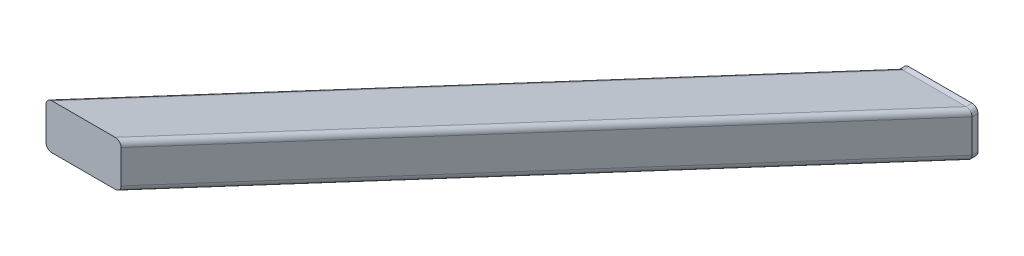
ISO-10303-21;
HEADER;
FILE_DESCRIPTION(('STEP AP214'),'2;1');
FILE_NAME('part.step','',(''),(''),'','','');
FILE_SCHEMA(('AUTOMOTIVE_DESIGN { 1 0 10303 214 1 1 1 1 }'));
ENDSEC;
DATA;
#1=APPLICATION_CONTEXT('core data for automotive mechanical design processes');
#2=APPLICATION_PROTOCOL_DEFINITION('international standard','automotive_design',2000,#1);
#3=PRODUCT_CONTEXT('',#1,'mechanical');
#4=PRODUCT('Part','Part','',(#3));
#5=PRODUCT_RELATED_PRODUCT_CATEGORY('part','',(#4));
#6=PRODUCT_DEFINITION_FORMATION('','',#4);
#7=PRODUCT_DEFINITION_CONTEXT('part definition',#1,'design');
#8=PRODUCT_DEFINITION('design','',#6,#7);
#9=PRODUCT_DEFINITION_SHAPE('','',#8);
#10=(LENGTH_UNIT() NAMED_UNIT(*) SI_UNIT(.MILLI.,.METRE.));
#11=(NAMED_UNIT(*) PLANE_ANGLE_UNIT() SI_UNIT($,.RADIAN.));
#12=(NAMED_UNIT(*) SI_UNIT($,.STERADIAN.) SOLID_ANGLE_UNIT());
#13=UNCERTAINTY_MEASURE_WITH_UNIT(LENGTH_MEASURE(1.E-05),#10,'distance_accuracy_value','');
#14=(GEOMETRIC_REPRESENTATION_CONTEXT(3) GLOBAL_UNCERTAINTY_ASSIGNED_CONTEXT((#13)) GLOBAL_UNIT_ASSIGNED_CONTEXT((#10,
#11,#12)) REPRESENTATION_CONTEXT('',''));
#15=CARTESIAN_POINT('',(0.,0.,0.));
#16=DIRECTION('',(0.,0.,1.));
#17=DIRECTION('',(1.,0.,0.));
#18=AXIS2_PLACEMENT_3D('',#15,#16,#17);
#19=CARTESIAN_POINT('',(10.,-66.2,10.));
#20=DIRECTION('',(0.,0.,-1.));
#21=DIRECTION('',(-1.,0.,0.));
#22=AXIS2_PLACEMENT_3D('',#19,#20,#21);
#23=CYLINDRICAL_SURFACE('',#22,10.);
#24=CARTESIAN_POINT('',(10.,-66.2,0.));
#25=DIRECTION('',(0.,0.,1.));
#26=DIRECTION('',(1.,0.,0.));
#27=AXIS2_PLACEMENT_3D('',#24,#25,#26);
#28=CIRCLE('',#27,10.);
#29=CARTESIAN_POINT('',(0.,-66.1999999999999,0.));
#30=VERTEX_POINT('',#29);
#31=CARTESIAN_POINT('',(10.0000000000001,-76.2,0.));
#32=VERTEX_POINT('',#31);
#33=EDGE_CURVE('E169',#30,#32,#28,.T.);
#34=ORIENTED_EDGE('',*,*,#33,.T.);
#35=DIRECTION('',(0.,0.,-1.));
#36=VECTOR('',#35,1.);
#37=CARTESIAN_POINT('',(10.0000000000001,-76.2,10.));
#38=LINE('',#37,#36);
#39=CARTESIAN_POINT('',(10.0000000000001,-76.2,10.));
#40=VERTEX_POINT('',#39);
#41=EDGE_CURVE('E11',#40,#32,#38,.T.);
#42=ORIENTED_EDGE('',*,*,#41,.F.);
#43=CARTESIAN_POINT('',(10.,-66.2,10.));
#44=DIRECTION('',(0.,0.,1.));
#45=DIRECTION('',(1.,0.,0.));
#46=AXIS2_PLACEMENT_3D('',#43,#44,#45);
#47=CIRCLE('',#46,10.);
#48=CARTESIAN_POINT('',(0.,-66.1999999999999,10.0000000000001));
#49=VERTEX_POINT('',#48);
#50=EDGE_CURVE('E173',#49,#40,#47,.T.);
#51=ORIENTED_EDGE('',*,*,#50,.F.);
#52=DIRECTION('',(0.,0.,-1.));
#53=VECTOR('',#52,1.);
#54=CARTESIAN_POINT('',(0.,-66.1999999999999,10.));
#55=LINE('',#54,#53);
#56=EDGE_CURVE('E186',#49,#30,#55,.T.);
#57=ORIENTED_EDGE('',*,*,#56,.T.);
#58=EDGE_LOOP('',(#34,#42,#51,#57));
#59=FACE_BOUND('',#58,.T.);
#60=ADVANCED_FACE('F35',(#59),#23,.T.);
#61=CARTESIAN_POINT('',(10.0000000000001,-76.2,10.));
#62=DIRECTION('',(0.,1.,0.));
#63=DIRECTION('',(0.,0.,1.));
#64=AXIS2_PLACEMENT_3D('',#61,#62,#63);
#65=PLANE('',#64);
#66=DIRECTION('',(1.,0.,0.));
#67=VECTOR('',#66,1.);
#68=CARTESIAN_POINT('',(10.0000000000001,-76.2,0.));
#69=LINE('',#68,#67);
#70=CARTESIAN_POINT('',(117.,-76.2,0.));
#71=VERTEX_POINT('',#70);
#72=EDGE_CURVE('E189',#32,#71,#69,.T.);
#73=ORIENTED_EDGE('',*,*,#72,.T.);
#74=DIRECTION('',(0.,0.,-1.));
#75=VECTOR('',#74,1.);
#76=CARTESIAN_POINT('',(117.,-76.2,10.));
#77=LINE('',#76,#75);
#78=CARTESIAN_POINT('',(117.,-76.2,10.));
#79=VERTEX_POINT('',#78);
#80=EDGE_CURVE('E43',#79,#71,#77,.T.);
#81=ORIENTED_EDGE('',*,*,#80,.F.);
#82=DIRECTION('',(1.,0.,0.));
#83=VECTOR('',#82,1.);
#84=CARTESIAN_POINT('',(10.0000000000001,-76.2,10.));
#85=LINE('',#84,#83);
#86=EDGE_CURVE('E93',#40,#79,#85,.T.);
#87=ORIENTED_EDGE('',*,*,#86,.F.);
#88=ORIENTED_EDGE('',*,*,#41,.T.);
#89=EDGE_LOOP('',(#73,#81,#87,#88));
#90=FACE_BOUND('',#89,.T.);
#91=ADVANCED_FACE('F285',(#90),#65,.F.);
#92=CARTESIAN_POINT('',(117.,-66.2,10.));
#93=DIRECTION('',(0.,0.,-1.));
#94=DIRECTION('',(-1.,0.,0.));
#95=AXIS2_PLACEMENT_3D('',#92,#93,#94);
#96=CYLINDRICAL_SURFACE('',#95,10.);
#97=CARTESIAN_POINT('',(117.,-66.2,0.));
#98=DIRECTION('',(0.,0.,1.));
#99=DIRECTION('',(1.,0.,0.));
#100=AXIS2_PLACEMENT_3D('',#97,#98,#99);
#101=CIRCLE('',#100,10.);
#102=CARTESIAN_POINT('',(127.,-66.1999999999999,0.));
#103=VERTEX_POINT('',#102);
#104=EDGE_CURVE('E191',#71,#103,#101,.T.);
#105=ORIENTED_EDGE('',*,*,#104,.T.);
#106=DIRECTION('',(0.,0.,-1.));
#107=VECTOR('',#106,1.);
#108=CARTESIAN_POINT('',(127.,-66.1999999999999,10.));
#109=LINE('',#108,#107);
#110=CARTESIAN_POINT('',(127.,-66.1999999999999,10.));
#111=VERTEX_POINT('',#110);
#112=EDGE_CURVE('E204',#111,#103,#109,.T.);
#113=ORIENTED_EDGE('',*,*,#112,.F.);
#114=CARTESIAN_POINT('',(117.,-66.2,10.));
#115=DIRECTION('',(0.,0.,1.));
#116=DIRECTION('',(1.,0.,0.));
#117=AXIS2_PLACEMENT_3D('',#114,#115,#116);
#118=CIRCLE('',#117,10.);
#119=EDGE_CURVE('E177',#79,#111,#118,.T.);
#120=ORIENTED_EDGE('',*,*,#119,.F.);
#121=ORIENTED_EDGE('',*,*,#80,.T.);
#122=EDGE_LOOP('',(#105,#113,#120,#121));
#123=FACE_BOUND('',#122,.T.);
#124=ADVANCED_FACE('F210',(#123),#96,.T.);
#125=CARTESIAN_POINT('',(127.,-10.0000000000001,10.));
#126=DIRECTION('',(-1.,0.,0.));
#127=DIRECTION('',(0.,0.,1.));
#128=AXIS2_PLACEMENT_3D('',#125,#126,#127);
#129=PLANE('',#128);
#130=DIRECTION('',(0.,1.,0.));
#131=VECTOR('',#130,1.);
#132=CARTESIAN_POINT('',(127.,-10.0000000000001,0.));
#133=LINE('',#132,#131);
#134=CARTESIAN_POINT('',(127.,-10.0000000000001,0.));
#135=VERTEX_POINT('',#134);
#136=EDGE_CURVE('E193',#103,#135,#133,.T.);
#137=ORIENTED_EDGE('',*,*,#136,.T.);
#138=DIRECTION('',(0.,0.,-1.));
#139=VECTOR('',#138,1.);
#140=CARTESIAN_POINT('',(127.,-10.0000000000001,10.));
#141=LINE('',#140,#139);
#142=CARTESIAN_POINT('',(127.,-10.0000000000001,10.));
#143=VERTEX_POINT('',#142);
#144=EDGE_CURVE('E119',#143,#135,#141,.T.);
#145=ORIENTED_EDGE('',*,*,#144,.F.);
#146=DIRECTION('',(0.,1.,0.));
#147=VECTOR('',#146,1.);
#148=CARTESIAN_POINT('',(127.,-10.0000000000001,10.));
#149=LINE('',#148,#147);
#150=EDGE_CURVE('E140',#111,#143,#149,.T.);
#151=ORIENTED_EDGE('',*,*,#150,.F.);
#152=ORIENTED_EDGE('',*,*,#112,.T.);
#153=EDGE_LOOP('',(#137,#145,#151,#152));
#154=FACE_BOUND('',#153,.T.);
#155=ADVANCED_FACE('F216',(#154),#129,.F.);
#156=CARTESIAN_POINT('',(117.,-10.,10.));
#157=DIRECTION('',(0.,0.,-1.));
#158=DIRECTION('',(-1.,0.,0.));
#159=AXIS2_PLACEMENT_3D('',#156,#157,#158);
#160=CYLINDRICAL_SURFACE('',#159,10.);
#161=CARTESIAN_POINT('',(117.,-10.,0.));
#162=DIRECTION('',(0.,0.,1.));
#163=DIRECTION('',(-1.,0.,0.));
#164=AXIS2_PLACEMENT_3D('',#161,#162,#163);
#165=CIRCLE('',#164,10.);
#166=CARTESIAN_POINT('',(117.,0.,0.));
#167=VERTEX_POINT('',#166);
#168=EDGE_CURVE('E116',#135,#167,#165,.T.);
#169=ORIENTED_EDGE('',*,*,#168,.T.);
#170=DIRECTION('',(0.,0.,-1.));
#171=VECTOR('',#170,1.);
#172=CARTESIAN_POINT('',(117.,0.,10.));
#173=LINE('',#172,#171);
#174=CARTESIAN_POINT('',(117.,0.,10.));
#175=VERTEX_POINT('',#174);
#176=EDGE_CURVE('E108',#175,#167,#173,.T.);
#177=ORIENTED_EDGE('',*,*,#176,.F.);
#178=CARTESIAN_POINT('',(117.,-10.,10.));
#179=DIRECTION('',(0.,0.,1.));
#180=DIRECTION('',(-1.,0.,0.));
#181=AXIS2_PLACEMENT_3D('',#178,#179,#180);
#182=CIRCLE('',#181,10.);
#183=EDGE_CURVE('E113',#143,#175,#182,.T.);
#184=ORIENTED_EDGE('',*,*,#183,.F.);
#185=ORIENTED_EDGE('',*,*,#144,.T.);
#186=EDGE_LOOP('',(#169,#177,#184,#185));
#187=FACE_BOUND('',#186,.T.);
#188=ADVANCED_FACE('F110',(#187),#160,.T.);
#189=CARTESIAN_POINT('',(10.0000000000001,0.,10.));
#190=DIRECTION('',(0.,-1.,0.));
#191=DIRECTION('',(0.,0.,-1.));
#192=AXIS2_PLACEMENT_3D('',#189,#190,#191);
#193=PLANE('',#192);
#194=DIRECTION('',(-1.,0.,0.));
#195=VECTOR('',#194,1.);
#196=CARTESIAN_POINT('',(10.0000000000001,0.,0.));
#197=LINE('',#196,#195);
#198=CARTESIAN_POINT('',(10.0000000000001,0.,0.));
#199=VERTEX_POINT('',#198);
#200=EDGE_CURVE('E196',#167,#199,#197,.T.);
#201=ORIENTED_EDGE('',*,*,#200,.T.);
#202=DIRECTION('',(0.,0.,-1.));
#203=VECTOR('',#202,1.);
#204=CARTESIAN_POINT('',(10.0000000000001,0.,10.));
#205=LINE('',#204,#203);
#206=CARTESIAN_POINT('',(10.0000000000001,0.,10.));
#207=VERTEX_POINT('',#206);
#208=EDGE_CURVE('E120',#207,#199,#205,.T.);
#209=ORIENTED_EDGE('',*,*,#208,.F.);
#210=DIRECTION('',(-1.,0.,0.));
#211=VECTOR('',#210,1.);
#212=CARTESIAN_POINT('',(10.0000000000001,0.,10.));
#213=LINE('',#212,#211);
#214=EDGE_CURVE('E123',#175,#207,#213,.T.);
#215=ORIENTED_EDGE('',*,*,#214,.F.);
#216=ORIENTED_EDGE('',*,*,#176,.T.);
#217=EDGE_LOOP('',(#201,#209,#215,#216));
#218=FACE_BOUND('',#217,.T.);
#219=ADVANCED_FACE('F124',(#218),#193,.F.);
#220=CARTESIAN_POINT('',(10.,-10.,10.));
#221=DIRECTION('',(0.,0.,-1.));
#222=DIRECTION('',(-1.,0.,0.));
#223=AXIS2_PLACEMENT_3D('',#220,#221,#222);
#224=CYLINDRICAL_SURFACE('',#223,10.);
#225=CARTESIAN_POINT('',(10.,-10.,0.));
#226=DIRECTION('',(0.,0.,1.));
#227=DIRECTION('',(1.,0.,0.));
#228=AXIS2_PLACEMENT_3D('',#225,#226,#227);
#229=CIRCLE('',#228,10.);
#230=CARTESIAN_POINT('',(0.,-10.0000000000001,0.));
#231=VERTEX_POINT('',#230);
#232=EDGE_CURVE('E79',#199,#231,#229,.T.);
#233=ORIENTED_EDGE('',*,*,#232,.T.);
#234=DIRECTION('',(0.,0.,-1.));
#235=VECTOR('',#234,1.);
#236=CARTESIAN_POINT('',(0.,-10.0000000000001,10.));
#237=LINE('',#236,#235);
#238=CARTESIAN_POINT('',(0.,-10.0000000000001,10.));
#239=VERTEX_POINT('',#238);
#240=EDGE_CURVE('E51',#239,#231,#237,.T.);
#241=ORIENTED_EDGE('',*,*,#240,.F.);
#242=CARTESIAN_POINT('',(10.,-10.,10.));
#243=DIRECTION('',(0.,0.,1.));
#244=DIRECTION('',(1.,0.,0.));
#245=AXIS2_PLACEMENT_3D('',#242,#243,#244);
#246=CIRCLE('',#245,10.);
#247=EDGE_CURVE('E129',#207,#239,#246,.T.);
#248=ORIENTED_EDGE('',*,*,#247,.F.);
#249=ORIENTED_EDGE('',*,*,#208,.T.);
#250=EDGE_LOOP('',(#233,#241,#248,#249));
#251=FACE_BOUND('',#250,.T.);
#252=ADVANCED_FACE('F275',(#251),#224,.T.);
#253=CARTESIAN_POINT('',(0.,-10.0000000000001,10.));
#254=DIRECTION('',(1.,0.,0.));
#255=DIRECTION('',(0.,1.,0.));
#256=AXIS2_PLACEMENT_3D('',#253,#254,#255);
#257=PLANE('',#256);
#258=DIRECTION('',(0.,-1.,0.));
#259=VECTOR('',#258,1.);
#260=CARTESIAN_POINT('',(0.,-10.0000000000001,0.));
#261=LINE('',#260,#259);
#262=EDGE_CURVE('E85',#231,#30,#261,.T.);
#263=ORIENTED_EDGE('',*,*,#262,.T.);
#264=ORIENTED_EDGE('',*,*,#56,.F.);
#265=DIRECTION('',(0.,-1.,0.));
#266=VECTOR('',#265,1.);
#267=CARTESIAN_POINT('',(0.,-10.0000000000001,10.));
#268=LINE('',#267,#266);
#269=EDGE_CURVE('E183',#239,#49,#268,.T.);
#270=ORIENTED_EDGE('',*,*,#269,.F.);
#271=ORIENTED_EDGE('',*,*,#240,.T.);
#272=EDGE_LOOP('',(#263,#264,#270,#271));
#273=FACE_BOUND('',#272,.T.);
#274=ADVANCED_FACE('F268',(#273),#257,.F.);
#275=CARTESIAN_POINT('',(10.,-66.2,0.));
#276=DIRECTION('',(0.,0.,1.));
#277=DIRECTION('',(1.,0.,0.));
#278=AXIS2_PLACEMENT_3D('',#275,#276,#277);
#279=PLANE('',#278);
#280=ORIENTED_EDGE('',*,*,#33,.F.);
#281=ORIENTED_EDGE('',*,*,#262,.F.);
#282=ORIENTED_EDGE('',*,*,#232,.F.);
#283=ORIENTED_EDGE('',*,*,#200,.F.);
#284=ORIENTED_EDGE('',*,*,#168,.F.);
#285=ORIENTED_EDGE('',*,*,#136,.F.);
#286=ORIENTED_EDGE('',*,*,#104,.F.);
#287=ORIENTED_EDGE('',*,*,#72,.F.);
#288=EDGE_LOOP('',(#280,#281,#282,#283,#284,#285,#286,#287));
#289=FACE_BOUND('',#288,.T.);
#290=ADVANCED_FACE('F214',(#289),#279,.F.);
#291=CARTESIAN_POINT('',(-440.,158.8,1000.));
#292=DIRECTION('',(0.,0.,-1.));
#293=DIRECTION('',(-1.,0.,0.));
#294=AXIS2_PLACEMENT_3D('',#291,#292,#293);
#295=PLANE('',#294);
#296=CARTESIAN_POINT('',(-440.,158.8,1000.));
#297=DIRECTION('',(0.,0.,1.));
#298=DIRECTION('',(-1.,0.,0.));
#299=AXIS2_PLACEMENT_3D('',#296,#297,#298);
#300=CIRCLE('',#299,10.);
#301=CARTESIAN_POINT('',(-450.,158.8,1000.));
#302=VERTEX_POINT('',#301);
#303=CARTESIAN_POINT('',(-440.,148.8,1000.));
#304=VERTEX_POINT('',#303);
#305=EDGE_CURVE('E166',#302,#304,#300,.T.);
#306=ORIENTED_EDGE('',*,*,#305,.T.);
#307=DIRECTION('',(1.,0.,0.));
#308=VECTOR('',#307,1.);
#309=CARTESIAN_POINT('',(-440.,148.8,1000.));
#310=LINE('',#309,#308);
#311=CARTESIAN_POINT('',(-333.,148.8,1000.));
#312=VERTEX_POINT('',#311);
#313=EDGE_CURVE('E241',#304,#312,#310,.T.);
#314=ORIENTED_EDGE('',*,*,#313,.T.);
#315=CARTESIAN_POINT('',(-333.,158.8,1000.));
#316=DIRECTION('',(0.,0.,1.));
#317=DIRECTION('',(1.,0.,0.));
#318=AXIS2_PLACEMENT_3D('',#315,#316,#317);
#319=CIRCLE('',#318,9.99999999999999);
#320=CARTESIAN_POINT('',(-323.,158.8,1000.));
#321=VERTEX_POINT('',#320);
#322=EDGE_CURVE('E237',#312,#321,#319,.T.);
#323=ORIENTED_EDGE('',*,*,#322,.T.);
#324=DIRECTION('',(0.,1.,0.));
#325=VECTOR('',#324,1.);
#326=CARTESIAN_POINT('',(-323.,158.8,1000.));
#327=LINE('',#326,#325);
#328=CARTESIAN_POINT('',(-323.,215.,1000.));
#329=VERTEX_POINT('',#328);
#330=EDGE_CURVE('E231',#321,#329,#327,.T.);
#331=ORIENTED_EDGE('',*,*,#330,.T.);
#332=CARTESIAN_POINT('',(-333.,215.,1000.));
#333=DIRECTION('',(0.,0.,1.));
#334=DIRECTION('',(-1.,0.,0.));
#335=AXIS2_PLACEMENT_3D('',#332,#333,#334);
#336=CIRCLE('',#335,10.);
#337=CARTESIAN_POINT('',(-333.,225.,1000.));
#338=VERTEX_POINT('',#337);
#339=EDGE_CURVE('E155',#329,#338,#336,.T.);
#340=ORIENTED_EDGE('',*,*,#339,.T.);
#341=DIRECTION('',(-1.,0.,0.));
#342=VECTOR('',#341,1.);
#343=CARTESIAN_POINT('',(-440.,225.,1000.));
#344=LINE('',#343,#342);
#345=CARTESIAN_POINT('',(-440.,225.,1000.));
#346=VERTEX_POINT('',#345);
#347=EDGE_CURVE('E145',#338,#346,#344,.T.);
#348=ORIENTED_EDGE('',*,*,#347,.T.);
#349=CARTESIAN_POINT('',(-440.,215.,1000.));
#350=DIRECTION('',(0.,0.,1.));
#351=DIRECTION('',(-1.,0.,0.));
#352=AXIS2_PLACEMENT_3D('',#349,#350,#351);
#353=CIRCLE('',#352,10.);
#354=CARTESIAN_POINT('',(-450.,215.,1000.));
#355=VERTEX_POINT('',#354);
#356=EDGE_CURVE('E156',#346,#355,#353,.T.);
#357=ORIENTED_EDGE('',*,*,#356,.T.);
#358=DIRECTION('',(0.,-1.,0.));
#359=VECTOR('',#358,1.);
#360=CARTESIAN_POINT('',(-450.,158.8,1000.));
#361=LINE('',#360,#359);
#362=EDGE_CURVE('E160',#355,#302,#361,.T.);
#363=ORIENTED_EDGE('',*,*,#362,.T.);
#364=EDGE_LOOP('',(#306,#314,#323,#331,#340,#348,#357,#363));
#365=FACE_BOUND('',#364,.T.);
#366=ADVANCED_FACE('F322',(#365),#295,.F.);
#367=CARTESIAN_POINT('',(-440.,148.8,1000.));
#368=DIRECTION('',(0.,0.97513285579146,-0.221621103588968));
#369=DIRECTION('',(0.,0.221621103588968,0.97513285579146));
#370=AXIS2_PLACEMENT_3D('',#367,#368,#369);
#371=PLANE('',#370);
#372=DIRECTION('',(0.405220449236554,-0.202610224618277,-0.891484988320418));
#373=VECTOR('',#372,1.);
#374=CARTESIAN_POINT('',(-333.,148.8,1000.));
#375=LINE('',#374,#373);
#376=EDGE_CURVE('E227',#312,#79,#375,.T.);
#377=ORIENTED_EDGE('',*,*,#376,.F.);
#378=ORIENTED_EDGE('',*,*,#313,.F.);
#379=DIRECTION('',(0.405220449236554,-0.202610224618277,-0.891484988320418));
#380=VECTOR('',#379,1.);
#381=CARTESIAN_POINT('',(-440.,148.8,1000.));
#382=LINE('',#381,#380);
#383=EDGE_CURVE('E172',#304,#40,#382,.T.);
#384=ORIENTED_EDGE('',*,*,#383,.T.);
#385=ORIENTED_EDGE('',*,*,#86,.T.);
#386=EDGE_LOOP('',(#377,#378,#384,#385));
#387=FACE_BOUND('',#386,.T.);
#388=ADVANCED_FACE('F249',(#387),#371,.F.);
#389=CARTESIAN_POINT('',(-333.,148.8,1000.));
#390=CARTESIAN_POINT('',(117.,-76.2000000000001,9.99999999999979));
#391=CARTESIAN_POINT('',(-327.142135623731,148.8,1000.));
#392=CARTESIAN_POINT('',(122.857864376269,-76.2000000000001,9.99999999999968));
#393=CARTESIAN_POINT('',(-323.,152.942135623731,1000.));
#394=CARTESIAN_POINT('',(127.,-72.0578643762691,9.99999999999968));
#395=CARTESIAN_POINT('',(-323.,158.8,1000.));
#396=CARTESIAN_POINT('',(127.,-66.2000000000001,9.99999999999979));
#397=(BOUNDED_SURFACE() B_SPLINE_SURFACE(3,1,((#389,#390),(#391,#392),(#393,#394),(#395,#396)),
.UNSPECIFIED.,.F.,.F.,.F.) B_SPLINE_SURFACE_WITH_KNOTS((4,4),(2,2),(0.,1.),(0.,1.),
.UNSPECIFIED.) GEOMETRIC_REPRESENTATION_ITEM() RATIONAL_B_SPLINE_SURFACE(((1.,1.),
(0.804737854124363,0.804737854124363),(0.804737854124363,0.804737854124363),(1.,1.))) REPRESENTATION_ITEM('') SURFACE());
#398=DIRECTION('',(0.405220449236554,-0.202610224618277,-0.891484988320418));
#399=VECTOR('',#398,1.);
#400=CARTESIAN_POINT('',(-323.,158.8,1000.));
#401=LINE('',#400,#399);
#402=EDGE_CURVE('E151',#321,#111,#401,.T.);
#403=ORIENTED_EDGE('',*,*,#402,.F.);
#404=ORIENTED_EDGE('',*,*,#322,.F.);
#405=ORIENTED_EDGE('',*,*,#376,.T.);
#406=ORIENTED_EDGE('',*,*,#119,.T.);
#407=EDGE_LOOP('',(#403,#404,#405,#406));
#408=FACE_BOUND('',#407,.T.);
#409=ADVANCED_FACE('F223',(#408),#397,.F.);
#410=CARTESIAN_POINT('',(-323.,158.8,1000.));
#411=DIRECTION('',(-0.910366477462605,0.,-0.413802944301184));
#412=DIRECTION('',(-0.413802944301184,0.,0.910366477462605));
#413=AXIS2_PLACEMENT_3D('',#410,#411,#412);
#414=PLANE('',#413);
#415=DIRECTION('',(0.405220449236554,-0.202610224618277,-0.891484988320418));
#416=VECTOR('',#415,1.);
#417=CARTESIAN_POINT('',(-323.,215.,1000.));
#418=LINE('',#417,#416);
#419=EDGE_CURVE('E139',#329,#143,#418,.T.);
#420=ORIENTED_EDGE('',*,*,#419,.F.);
#421=ORIENTED_EDGE('',*,*,#330,.F.);
#422=ORIENTED_EDGE('',*,*,#402,.T.);
#423=ORIENTED_EDGE('',*,*,#150,.T.);
#424=EDGE_LOOP('',(#420,#421,#422,#423));
#425=FACE_BOUND('',#424,.T.);
#426=ADVANCED_FACE('F229',(#425),#414,.F.);
#427=CARTESIAN_POINT('',(-323.,215.,1000.));
#428=CARTESIAN_POINT('',(127.,-10.0000000000001,9.99999999999979));
#429=CARTESIAN_POINT('',(-323.,220.857864376269,1000.));
#430=CARTESIAN_POINT('',(127.,-4.14213562373103,9.9999999999997));
#431=CARTESIAN_POINT('',(-327.142135623731,225.,1000.));
#432=CARTESIAN_POINT('',(122.857864376269,0.,9.9999999999997));
#433=CARTESIAN_POINT('',(-333.,225.,1000.));
#434=CARTESIAN_POINT('',(117.,0.,9.99999999999979));
#435=(BOUNDED_SURFACE() B_SPLINE_SURFACE(3,1,((#427,#428),(#429,#430),(#431,#432),(#433,#434)),
.UNSPECIFIED.,.F.,.F.,.F.) B_SPLINE_SURFACE_WITH_KNOTS((4,4),(2,2),(0.,1.),(0.,1.),
.UNSPECIFIED.) GEOMETRIC_REPRESENTATION_ITEM() RATIONAL_B_SPLINE_SURFACE(((1.,1.),
(0.804737854124362,0.804737854124362),(0.804737854124362,0.804737854124362),(1.,1.))) REPRESENTATION_ITEM('') SURFACE());
#436=DIRECTION('',(0.405220449236554,-0.202610224618277,-0.891484988320418));
#437=VECTOR('',#436,1.);
#438=CARTESIAN_POINT('',(-333.,225.,1000.));
#439=LINE('',#438,#437);
#440=EDGE_CURVE('E137',#338,#175,#439,.T.);
#441=ORIENTED_EDGE('',*,*,#440,.F.);
#442=ORIENTED_EDGE('',*,*,#339,.F.);
#443=ORIENTED_EDGE('',*,*,#419,.T.);
#444=ORIENTED_EDGE('',*,*,#183,.T.);
#445=EDGE_LOOP('',(#441,#442,#443,#444));
#446=FACE_BOUND('',#445,.T.);
#447=ADVANCED_FACE('F134',(#446),#435,.F.);
#448=CARTESIAN_POINT('',(-440.,225.,1000.));
#449=DIRECTION('',(0.,-0.97513285579146,0.221621103588968));
#450=DIRECTION('',(0.,-0.221621103588968,-0.97513285579146));
#451=AXIS2_PLACEMENT_3D('',#448,#449,#450);
#452=PLANE('',#451);
#453=DIRECTION('',(0.405220449236554,-0.202610224618277,-0.891484988320418));
#454=VECTOR('',#453,1.);
#455=CARTESIAN_POINT('',(-440.,225.,1000.));
#456=LINE('',#455,#454);
#457=EDGE_CURVE('E147',#346,#207,#456,.T.);
#458=ORIENTED_EDGE('',*,*,#457,.F.);
#459=ORIENTED_EDGE('',*,*,#347,.F.);
#460=ORIENTED_EDGE('',*,*,#440,.T.);
#461=ORIENTED_EDGE('',*,*,#214,.T.);
#462=EDGE_LOOP('',(#458,#459,#460,#461));
#463=FACE_BOUND('',#462,.T.);
#464=ADVANCED_FACE('F143',(#463),#452,.F.);
#465=CARTESIAN_POINT('',(-440.,225.,1000.));
#466=CARTESIAN_POINT('',(10.0000000000002,0.,9.99999999999979));
#467=CARTESIAN_POINT('',(-445.857864376269,225.,1000.));
#468=CARTESIAN_POINT('',(4.14213562373106,0.,9.99999999999968));
#469=CARTESIAN_POINT('',(-450.,220.857864376269,1000.));
#470=CARTESIAN_POINT('',(0.,-4.14213562373095,9.99999999999968));
#471=CARTESIAN_POINT('',(-450.,215.,1000.));
#472=CARTESIAN_POINT('',(1.11022302462516E-13,-10.0000000000001,9.99999999999979));
#473=(BOUNDED_SURFACE() B_SPLINE_SURFACE(3,1,((#465,#466),(#467,#468),(#469,#470),(#471,#472)),
.UNSPECIFIED.,.F.,.F.,.F.) B_SPLINE_SURFACE_WITH_KNOTS((4,4),(2,2),(0.,1.),(0.,1.),
.UNSPECIFIED.) GEOMETRIC_REPRESENTATION_ITEM() RATIONAL_B_SPLINE_SURFACE(((1.,1.),
(0.804737854124363,0.804737854124363),(0.804737854124363,0.804737854124363),(1.,1.))) REPRESENTATION_ITEM('') SURFACE());
#474=DIRECTION('',(0.405220449236554,-0.202610224618277,-0.891484988320418));
#475=VECTOR('',#474,1.);
#476=CARTESIAN_POINT('',(-450.,215.,1000.));
#477=LINE('',#476,#475);
#478=EDGE_CURVE('E149',#355,#239,#477,.T.);
#479=ORIENTED_EDGE('',*,*,#478,.F.);
#480=ORIENTED_EDGE('',*,*,#356,.F.);
#481=ORIENTED_EDGE('',*,*,#457,.T.);
#482=ORIENTED_EDGE('',*,*,#247,.T.);
#483=EDGE_LOOP('',(#479,#480,#481,#482));
#484=FACE_BOUND('',#483,.T.);
#485=ADVANCED_FACE('F274',(#484),#473,.F.);
#486=CARTESIAN_POINT('',(-450.,158.8,1000.));
#487=DIRECTION('',(0.910366477462605,0.,0.413802944301184));
#488=DIRECTION('',(0.413802944301184,0.,-0.910366477462605));
#489=AXIS2_PLACEMENT_3D('',#486,#487,#488);
#490=PLANE('',#489);
#491=DIRECTION('',(0.405220449236554,-0.202610224618277,-0.891484988320418));
#492=VECTOR('',#491,1.);
#493=CARTESIAN_POINT('',(-450.,158.8,1000.));
#494=LINE('',#493,#492);
#495=EDGE_CURVE('E163',#302,#49,#494,.T.);
#496=ORIENTED_EDGE('',*,*,#495,.F.);
#497=ORIENTED_EDGE('',*,*,#362,.F.);
#498=ORIENTED_EDGE('',*,*,#478,.T.);
#499=ORIENTED_EDGE('',*,*,#269,.T.);
#500=EDGE_LOOP('',(#496,#497,#498,#499));
#501=FACE_BOUND('',#500,.T.);
#502=ADVANCED_FACE('F271',(#501),#490,.F.);
#503=CARTESIAN_POINT('',(-450.,158.8,1000.));
#504=CARTESIAN_POINT('',(1.11022302462516E-13,-66.2,9.99999999999979));
#505=CARTESIAN_POINT('',(-450.,152.942135623731,1000.));
#506=CARTESIAN_POINT('',(0.,-72.0578643762691,9.9999999999997));
#507=CARTESIAN_POINT('',(-445.857864376269,148.8,1000.));
#508=CARTESIAN_POINT('',(4.14213562373106,-76.2000000000001,9.9999999999997));
#509=CARTESIAN_POINT('',(-440.,148.8,1000.));
#510=CARTESIAN_POINT('',(10.0000000000002,-76.2000000000001,9.99999999999979));
#511=(BOUNDED_SURFACE() B_SPLINE_SURFACE(3,1,((#503,#504),(#505,#506),(#507,#508),(#509,#510)),
.UNSPECIFIED.,.F.,.F.,.F.) B_SPLINE_SURFACE_WITH_KNOTS((4,4),(2,2),(0.,1.),(0.,1.),
.UNSPECIFIED.) GEOMETRIC_REPRESENTATION_ITEM() RATIONAL_B_SPLINE_SURFACE(((1.,1.),
(0.804737854124362,0.804737854124362),(0.804737854124362,0.804737854124362),(1.,1.))) REPRESENTATION_ITEM('') SURFACE());
#512=ORIENTED_EDGE('',*,*,#50,.T.);
#513=ORIENTED_EDGE('',*,*,#383,.F.);
#514=ORIENTED_EDGE('',*,*,#305,.F.);
#515=ORIENTED_EDGE('',*,*,#495,.T.);
#516=EDGE_LOOP('',(#512,#513,#514,#515));
#517=FACE_BOUND('',#516,.T.);
#518=ADVANCED_FACE('F253',(#517),#511,.F.);
#519=CLOSED_SHELL('',(#60,#91,#124,#155,#188,#219,#252,#274,#290,#366,#388,#409,#426,#447,#464,
#485,#502,#518));
#520=MANIFOLD_SOLID_BREP('B2',#519);
#521=ADVANCED_BREP_SHAPE_REPRESENTATION('',(#18,#520),#14);
#522=SHAPE_DEFINITION_REPRESENTATION(#9,#521);
ENDSEC;
END-ISO-10303-21;
